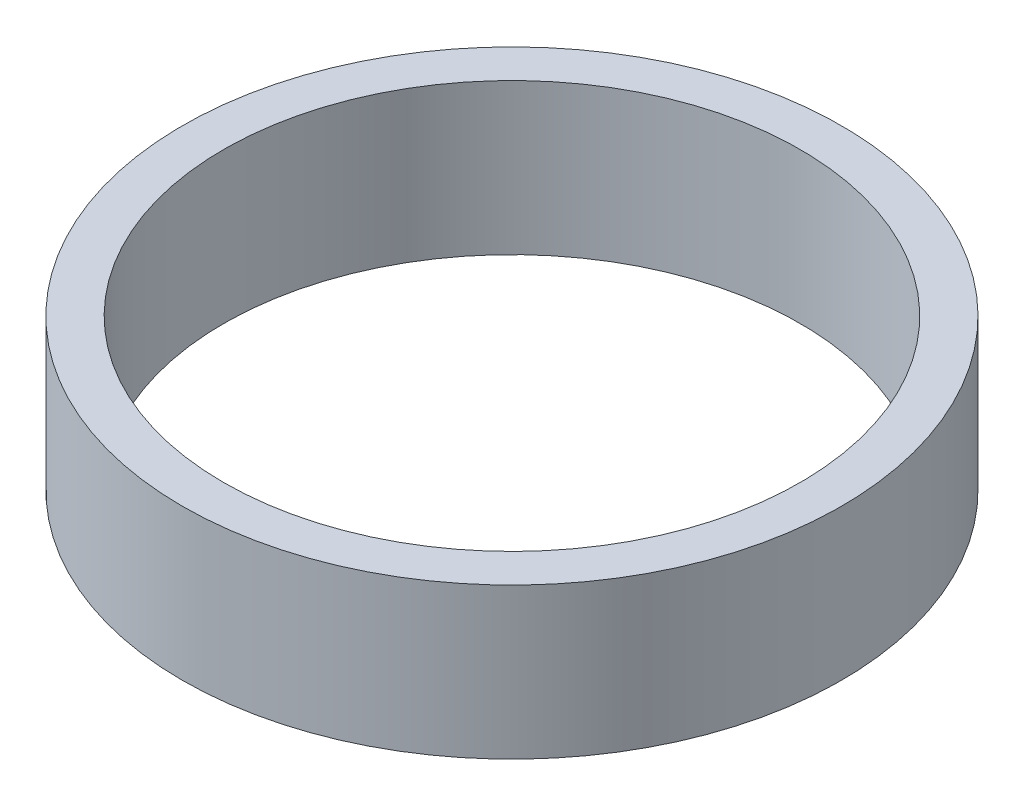
ISO-10303-21;
HEADER;
FILE_DESCRIPTION(('STEP AP214'),'2;1');
FILE_NAME('part.step','',(''),(''),'','','');
FILE_SCHEMA(('AUTOMOTIVE_DESIGN { 1 0 10303 214 1 1 1 1 }'));
ENDSEC;
DATA;
#1=APPLICATION_CONTEXT('core data for automotive mechanical design processes');
#2=APPLICATION_PROTOCOL_DEFINITION('international standard','automotive_design',2000,#1);
#3=PRODUCT_CONTEXT('',#1,'mechanical');
#4=PRODUCT('Part','Part','',(#3));
#5=PRODUCT_RELATED_PRODUCT_CATEGORY('part','',(#4));
#6=PRODUCT_DEFINITION_FORMATION('','',#4);
#7=PRODUCT_DEFINITION_CONTEXT('part definition',#1,'design');
#8=PRODUCT_DEFINITION('design','',#6,#7);
#9=PRODUCT_DEFINITION_SHAPE('','',#8);
#10=(LENGTH_UNIT() NAMED_UNIT(*) SI_UNIT(.MILLI.,.METRE.));
#11=(NAMED_UNIT(*) PLANE_ANGLE_UNIT() SI_UNIT($,.RADIAN.));
#12=(NAMED_UNIT(*) SI_UNIT($,.STERADIAN.) SOLID_ANGLE_UNIT());
#13=UNCERTAINTY_MEASURE_WITH_UNIT(LENGTH_MEASURE(1.E-05),#10,'distance_accuracy_value','');
#14=(GEOMETRIC_REPRESENTATION_CONTEXT(3) GLOBAL_UNCERTAINTY_ASSIGNED_CONTEXT((#13)) GLOBAL_UNIT_ASSIGNED_CONTEXT((#10,
#11,#12)) REPRESENTATION_CONTEXT('',''));
#15=CARTESIAN_POINT('',(0.,0.,0.));
#16=DIRECTION('',(0.,0.,1.));
#17=DIRECTION('',(1.,0.,0.));
#18=AXIS2_PLACEMENT_3D('',#15,#16,#17);
#19=CARTESIAN_POINT('',(0.,18.3,0.));
#20=DIRECTION('',(0.,1.,0.));
#21=DIRECTION('',(0.,0.,1.));
#22=AXIS2_PLACEMENT_3D('',#19,#20,#21);
#23=PLANE('',#22);
#24=CARTESIAN_POINT('',(0.,18.3,0.));
#25=DIRECTION('',(0.,1.,0.));
#26=DIRECTION('',(0.,0.,1.));
#27=AXIS2_PLACEMENT_3D('',#24,#25,#26);
#28=CIRCLE('',#27,40.);
#29=CARTESIAN_POINT('',(0.,18.3,40.));
#30=VERTEX_POINT('',#29);
#31=EDGE_CURVE('E10',#30,#30,#28,.T.);
#32=ORIENTED_EDGE('',*,*,#31,.T.);
#33=EDGE_LOOP('',(#32));
#34=FACE_BOUND('',#33,.T.);
#35=CARTESIAN_POINT('',(0.,18.3,0.));
#36=DIRECTION('',(0.,1.,0.));
#37=DIRECTION('',(0.,0.,1.));
#38=AXIS2_PLACEMENT_3D('',#35,#36,#37);
#39=CIRCLE('',#38,35.);
#40=CARTESIAN_POINT('',(0.,18.3,35.));
#41=VERTEX_POINT('',#40);
#42=EDGE_CURVE('E49',#41,#41,#39,.T.);
#43=ORIENTED_EDGE('',*,*,#42,.F.);
#44=EDGE_LOOP('',(#43));
#45=FACE_BOUND('',#44,.T.);
#46=ADVANCED_FACE('F39',(#34,#45),#23,.T.);
#47=CARTESIAN_POINT('',(0.,0.,0.));
#48=DIRECTION('',(0.,1.,0.));
#49=DIRECTION('',(0.,0.,1.));
#50=AXIS2_PLACEMENT_3D('',#47,#48,#49);
#51=PLANE('',#50);
#52=CARTESIAN_POINT('',(0.,0.,0.));
#53=DIRECTION('',(0.,1.,0.));
#54=DIRECTION('',(0.,0.,1.));
#55=AXIS2_PLACEMENT_3D('',#52,#53,#54);
#56=CIRCLE('',#55,40.);
#57=CARTESIAN_POINT('',(0.,0.,40.));
#58=VERTEX_POINT('',#57);
#59=EDGE_CURVE('E43',#58,#58,#56,.T.);
#60=ORIENTED_EDGE('',*,*,#59,.F.);
#61=EDGE_LOOP('',(#60));
#62=FACE_BOUND('',#61,.T.);
#63=CARTESIAN_POINT('',(0.,0.,0.));
#64=DIRECTION('',(0.,1.,0.));
#65=DIRECTION('',(0.,0.,1.));
#66=AXIS2_PLACEMENT_3D('',#63,#64,#65);
#67=CIRCLE('',#66,35.);
#68=CARTESIAN_POINT('',(0.,0.,35.));
#69=VERTEX_POINT('',#68);
#70=EDGE_CURVE('E55',#69,#69,#67,.T.);
#71=ORIENTED_EDGE('',*,*,#70,.T.);
#72=EDGE_LOOP('',(#71));
#73=FACE_BOUND('',#72,.T.);
#74=ADVANCED_FACE('F65',(#62,#73),#51,.F.);
#75=CARTESIAN_POINT('',(0.,18.3,0.));
#76=DIRECTION('',(0.,-1.,0.));
#77=DIRECTION('',(0.,0.,-1.));
#78=AXIS2_PLACEMENT_3D('',#75,#76,#77);
#79=CYLINDRICAL_SURFACE('',#78,40.);
#80=ORIENTED_EDGE('',*,*,#31,.F.);
#81=EDGE_LOOP('',(#80));
#82=FACE_BOUND('',#81,.T.);
#83=ORIENTED_EDGE('',*,*,#59,.T.);
#84=EDGE_LOOP('',(#83));
#85=FACE_BOUND('',#84,.T.);
#86=ADVANCED_FACE('F41',(#82,#85),#79,.T.);
#87=CARTESIAN_POINT('',(0.,18.3,0.));
#88=DIRECTION('',(0.,-1.,0.));
#89=DIRECTION('',(0.,0.,-1.));
#90=AXIS2_PLACEMENT_3D('',#87,#88,#89);
#91=CYLINDRICAL_SURFACE('',#90,35.);
#92=ORIENTED_EDGE('',*,*,#42,.T.);
#93=EDGE_LOOP('',(#92));
#94=FACE_BOUND('',#93,.T.);
#95=ORIENTED_EDGE('',*,*,#70,.F.);
#96=EDGE_LOOP('',(#95));
#97=FACE_BOUND('',#96,.T.);
#98=ADVANCED_FACE('F59',(#94,#97),#91,.F.);
#99=CLOSED_SHELL('',(#46,#74,#86,#98));
#100=MANIFOLD_SOLID_BREP('B2',#99);
#101=ADVANCED_BREP_SHAPE_REPRESENTATION('',(#18,#100),#14);
#102=SHAPE_DEFINITION_REPRESENTATION(#9,#101);
ENDSEC;
END-ISO-10303-21;
